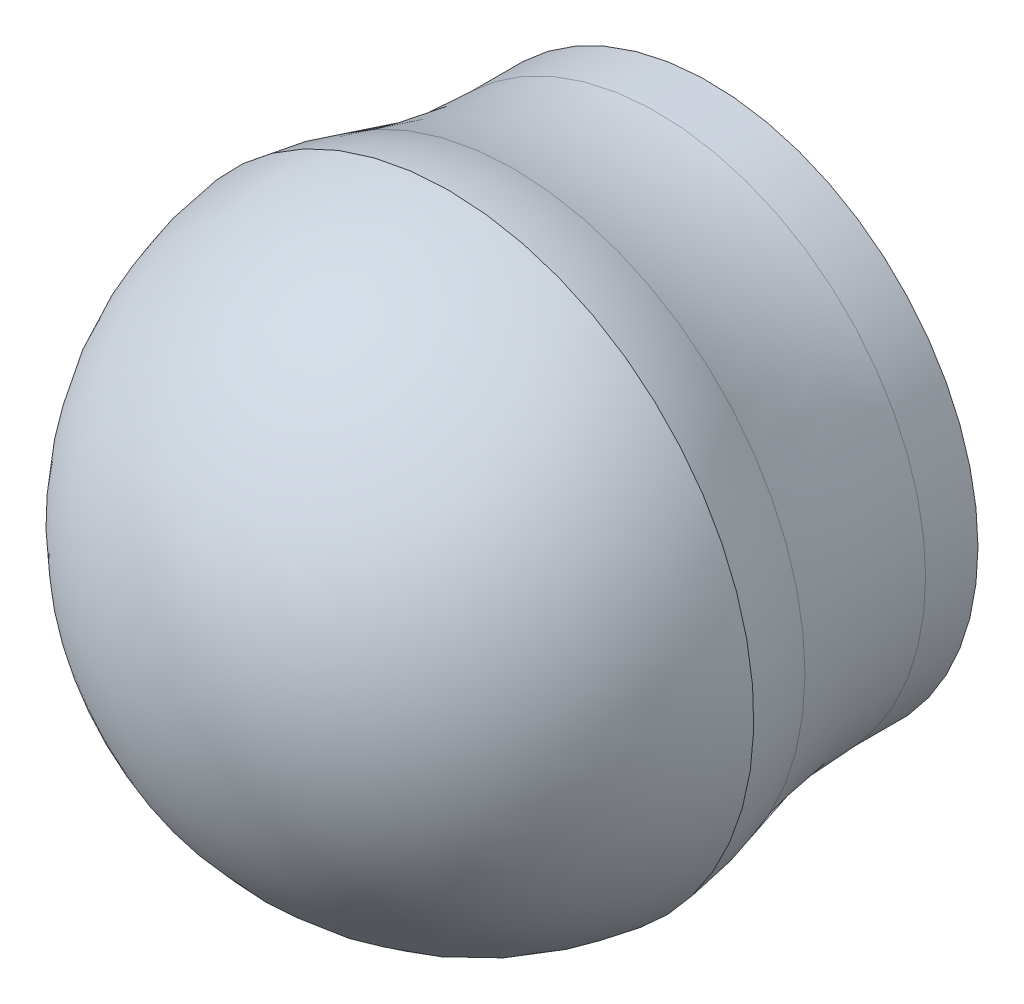
ISO-10303-21;
HEADER;
FILE_DESCRIPTION(('STEP AP214'),'2;1');
FILE_NAME('part.step','',(''),(''),'','','');
FILE_SCHEMA(('AUTOMOTIVE_DESIGN { 1 0 10303 214 1 1 1 1 }'));
ENDSEC;
DATA;
#1=APPLICATION_CONTEXT('core data for automotive mechanical design processes');
#2=APPLICATION_PROTOCOL_DEFINITION('international standard','automotive_design',2000,#1);
#3=PRODUCT_CONTEXT('',#1,'mechanical');
#4=PRODUCT('Part','Part','',(#3));
#5=PRODUCT_RELATED_PRODUCT_CATEGORY('part','',(#4));
#6=PRODUCT_DEFINITION_FORMATION('','',#4);
#7=PRODUCT_DEFINITION_CONTEXT('part definition',#1,'design');
#8=PRODUCT_DEFINITION('design','',#6,#7);
#9=PRODUCT_DEFINITION_SHAPE('','',#8);
#10=(LENGTH_UNIT() NAMED_UNIT(*) SI_UNIT(.MILLI.,.METRE.));
#11=(NAMED_UNIT(*) PLANE_ANGLE_UNIT() SI_UNIT($,.RADIAN.));
#12=(NAMED_UNIT(*) SI_UNIT($,.STERADIAN.) SOLID_ANGLE_UNIT());
#13=UNCERTAINTY_MEASURE_WITH_UNIT(LENGTH_MEASURE(1.E-05),#10,'distance_accuracy_value','');
#14=(GEOMETRIC_REPRESENTATION_CONTEXT(3) GLOBAL_UNCERTAINTY_ASSIGNED_CONTEXT((#13)) GLOBAL_UNIT_ASSIGNED_CONTEXT((#10,
#11,#12)) REPRESENTATION_CONTEXT('',''));
#15=CARTESIAN_POINT('',(0.,0.,0.));
#16=DIRECTION('',(0.,0.,1.));
#17=DIRECTION('',(1.,0.,0.));
#18=AXIS2_PLACEMENT_3D('',#15,#16,#17);
#19=CARTESIAN_POINT('',(0.,0.,57.847436919523));
#20=DIRECTION('',(0.,0.,1.));
#21=DIRECTION('',(0.,1.,0.));
#22=AXIS2_PLACEMENT_3D('',#19,#20,#21);
#23=SPHERICAL_SURFACE('',#22,18.);
#24=CARTESIAN_POINT('',(0.,0.,59.859750990432));
#25=DIRECTION('',(0.,0.,1.));
#26=DIRECTION('',(1.,0.,0.));
#27=AXIS2_PLACEMENT_3D('',#24,#25,#26);
#28=CIRCLE('',#27,17.8871627733417);
#29=CARTESIAN_POINT('',(17.8714322895514,0.75,59.859750990432));
#30=VERTEX_POINT('',#29);
#31=CARTESIAN_POINT('',(0.749999999999905,17.8714322895514,59.859750990432));
#32=VERTEX_POINT('',#31);
#33=EDGE_CURVE('E162',#30,#32,#28,.T.);
#34=ORIENTED_EDGE('',*,*,#33,.F.);
#35=CARTESIAN_POINT('',(0.,0.75,57.847436919523));
#36=DIRECTION('',(0.,1.,0.));
#37=DIRECTION('',(0.,0.,1.));
#38=AXIS2_PLACEMENT_3D('',#35,#36,#37);
#39=CIRCLE('',#38,17.9843682124227);
#40=CARTESIAN_POINT('',(7.46240577829965,0.750000000000001,74.2105050914765));
#41=VERTEX_POINT('',#40);
#42=EDGE_CURVE('E146',#41,#30,#39,.T.);
#43=ORIENTED_EDGE('',*,*,#42,.F.);
#44=CARTESIAN_POINT('',(0.,0.,74.2105050914765));
#45=DIRECTION('',(0.,0.,-1.));
#46=DIRECTION('',(-1.,0.,0.));
#47=AXIS2_PLACEMENT_3D('',#44,#45,#46);
#48=CIRCLE('',#47,7.5);
#49=CARTESIAN_POINT('',(0.749999999999943,7.46240577829965,74.2105050914765));
#50=VERTEX_POINT('',#49);
#51=EDGE_CURVE('E153',#50,#41,#48,.T.);
#52=ORIENTED_EDGE('',*,*,#51,.F.);
#53=CARTESIAN_POINT('',(0.749999999999971,0.,57.847436919523));
#54=DIRECTION('',(1.,0.,0.));
#55=DIRECTION('',(0.,1.,0.));
#56=AXIS2_PLACEMENT_3D('',#53,#54,#55);
#57=CIRCLE('',#56,17.9843682124227);
#58=EDGE_CURVE('E170',#32,#50,#57,.T.);
#59=ORIENTED_EDGE('',*,*,#58,.F.);
#60=EDGE_LOOP('',(#34,#43,#52,#59));
#61=FACE_BOUND('',#60,.T.);
#62=ADVANCED_FACE('F33',(#61),#23,.F.);
#63=CARTESIAN_POINT('',(-0.749999999999954,17.8714322895514,59.859750990432));
#64=VERTEX_POINT('',#63);
#65=CARTESIAN_POINT('',(-17.8714322895514,0.750000000000006,59.859750990432));
#66=VERTEX_POINT('',#65);
#67=EDGE_CURVE('E172',#64,#66,#28,.T.);
#68=ORIENTED_EDGE('',*,*,#67,.F.);
#69=CARTESIAN_POINT('',(-0.749999999999987,0.,57.847436919523));
#70=DIRECTION('',(-1.,0.,0.));
#71=DIRECTION('',(0.,-1.,0.));
#72=AXIS2_PLACEMENT_3D('',#69,#70,#71);
#73=CIRCLE('',#72,17.9843682124227);
#74=CARTESIAN_POINT('',(-0.749999999999974,7.46240577829965,74.2105050914765));
#75=VERTEX_POINT('',#74);
#76=EDGE_CURVE('E237',#75,#64,#73,.T.);
#77=ORIENTED_EDGE('',*,*,#76,.F.);
#78=CARTESIAN_POINT('',(0.,0.,74.2105050914765));
#79=DIRECTION('',(0.,0.,-1.));
#80=DIRECTION('',(-1.,0.,0.));
#81=AXIS2_PLACEMENT_3D('',#78,#79,#80);
#82=CIRCLE('',#81,7.5);
#83=CARTESIAN_POINT('',(-7.46240577829965,0.75,74.2105050914765));
#84=VERTEX_POINT('',#83);
#85=EDGE_CURVE('E234',#84,#75,#82,.T.);
#86=ORIENTED_EDGE('',*,*,#85,.F.);
#87=CARTESIAN_POINT('',(0.,0.75,57.847436919523));
#88=DIRECTION('',(0.,1.,0.));
#89=DIRECTION('',(0.,0.,1.));
#90=AXIS2_PLACEMENT_3D('',#87,#88,#89);
#91=CIRCLE('',#90,17.9843682124227);
#92=EDGE_CURVE('E230',#66,#84,#91,.T.);
#93=ORIENTED_EDGE('',*,*,#92,.F.);
#94=EDGE_LOOP('',(#68,#77,#86,#93));
#95=FACE_BOUND('',#94,.T.);
#96=ADVANCED_FACE('F328',(#95),#23,.F.);
#97=CARTESIAN_POINT('',(-17.8714322895514,-0.75,59.859750990432));
#98=VERTEX_POINT('',#97);
#99=CARTESIAN_POINT('',(-0.749999999999986,-17.8714322895514,59.859750990432));
#100=VERTEX_POINT('',#99);
#101=EDGE_CURVE('E180',#98,#100,#28,.T.);
#102=ORIENTED_EDGE('',*,*,#101,.F.);
#103=CARTESIAN_POINT('',(0.,-0.75,57.847436919523));
#104=DIRECTION('',(0.,-1.,0.));
#105=DIRECTION('',(0.,0.,-1.));
#106=AXIS2_PLACEMENT_3D('',#103,#104,#105);
#107=CIRCLE('',#106,17.9843682124227);
#108=CARTESIAN_POINT('',(-7.46240577829965,-0.750000000000001,74.2105050914765));
#109=VERTEX_POINT('',#108);
#110=EDGE_CURVE('E227',#109,#98,#107,.T.);
#111=ORIENTED_EDGE('',*,*,#110,.F.);
#112=CARTESIAN_POINT('',(0.,0.,74.2105050914765));
#113=DIRECTION('',(0.,0.,-1.));
#114=DIRECTION('',(-1.,0.,0.));
#115=AXIS2_PLACEMENT_3D('',#112,#113,#114);
#116=CIRCLE('',#115,7.5);
#117=CARTESIAN_POINT('',(-0.75,-7.46240577829965,74.2105050914765));
#118=VERTEX_POINT('',#117);
#119=EDGE_CURVE('E224',#118,#109,#116,.T.);
#120=ORIENTED_EDGE('',*,*,#119,.F.);
#121=CARTESIAN_POINT('',(-0.75,0.,57.847436919523));
#122=DIRECTION('',(-1.,0.,0.));
#123=DIRECTION('',(0.,-1.,0.));
#124=AXIS2_PLACEMENT_3D('',#121,#122,#123);
#125=CIRCLE('',#124,17.9843682124227);
#126=EDGE_CURVE('E220',#100,#118,#125,.T.);
#127=ORIENTED_EDGE('',*,*,#126,.F.);
#128=EDGE_LOOP('',(#102,#111,#120,#127));
#129=FACE_BOUND('',#128,.T.);
#130=ADVANCED_FACE('F311',(#129),#23,.F.);
#131=CARTESIAN_POINT('',(0.,0.,57.847436919523));
#132=DIRECTION('',(0.,0.,1.));
#133=DIRECTION('',(0.,1.,0.));
#134=AXIS2_PLACEMENT_3D('',#131,#132,#133);
#135=SPHERICAL_SURFACE('',#134,20.);
#136=CARTESIAN_POINT('',(0.,0.,59.859750990432));
#137=DIRECTION('',(0.,0.,1.));
#138=DIRECTION('',(1.,0.,0.));
#139=AXIS2_PLACEMENT_3D('',#136,#137,#138);
#140=CIRCLE('',#139,19.898507282709);
#141=CARTESIAN_POINT('',(0.,19.898507282709,59.859750990432));
#142=VERTEX_POINT('',#141);
#143=EDGE_CURVE('E205',#142,#142,#140,.T.);
#144=ORIENTED_EDGE('',*,*,#143,.T.);
#145=EDGE_LOOP('',(#144));
#146=FACE_BOUND('',#145,.T.);
#147=ADVANCED_FACE('F35',(#146),#135,.T.);
#148=CARTESIAN_POINT('',(0.75,-17.8714322895514,59.859750990432));
#149=VERTEX_POINT('',#148);
#150=CARTESIAN_POINT('',(17.8714322895514,-0.75,59.859750990432));
#151=VERTEX_POINT('',#150);
#152=EDGE_CURVE('E174',#149,#151,#28,.T.);
#153=ORIENTED_EDGE('',*,*,#152,.F.);
#154=CARTESIAN_POINT('',(0.749999999999999,0.,57.847436919523));
#155=DIRECTION('',(1.,0.,0.));
#156=DIRECTION('',(0.,1.,0.));
#157=AXIS2_PLACEMENT_3D('',#154,#155,#156);
#158=CIRCLE('',#157,17.9843682124227);
#159=CARTESIAN_POINT('',(0.750000000000001,-7.46240577829965,74.2105050914765));
#160=VERTEX_POINT('',#159);
#161=EDGE_CURVE('E217',#160,#149,#158,.T.);
#162=ORIENTED_EDGE('',*,*,#161,.F.);
#163=CARTESIAN_POINT('',(0.,0.,74.2105050914765));
#164=DIRECTION('',(0.,0.,-1.));
#165=DIRECTION('',(-1.,0.,0.));
#166=AXIS2_PLACEMENT_3D('',#163,#164,#165);
#167=CIRCLE('',#166,7.5);
#168=CARTESIAN_POINT('',(7.46240577829965,-0.75,74.2105050914765));
#169=VERTEX_POINT('',#168);
#170=EDGE_CURVE('E214',#169,#160,#167,.T.);
#171=ORIENTED_EDGE('',*,*,#170,.F.);
#172=CARTESIAN_POINT('',(0.,-0.75,57.847436919523));
#173=DIRECTION('',(0.,-1.,0.));
#174=DIRECTION('',(0.,0.,-1.));
#175=AXIS2_PLACEMENT_3D('',#172,#173,#174);
#176=CIRCLE('',#175,17.9843682124227);
#177=EDGE_CURVE('E209',#151,#169,#176,.T.);
#178=ORIENTED_EDGE('',*,*,#177,.F.);
#179=EDGE_LOOP('',(#153,#162,#171,#178));
#180=FACE_BOUND('',#179,.T.);
#181=ADVANCED_FACE('F346',(#180),#23,.F.);
#182=CARTESIAN_POINT('',(0.,0.,61.872065061341));
#183=DIRECTION('',(0.,0.,1.));
#184=DIRECTION('',(0.,1.,0.));
#185=AXIS2_PLACEMENT_3D('',#182,#183,#184);
#186=SPHERICAL_SURFACE('',#185,18.);
#187=ORIENTED_EDGE('',*,*,#101,.T.);
#188=CARTESIAN_POINT('',(-0.75,0.,61.872065061341));
#189=DIRECTION('',(-1.,0.,0.));
#190=DIRECTION('',(0.,-1.,0.));
#191=AXIS2_PLACEMENT_3D('',#188,#189,#190);
#192=CIRCLE('',#191,17.9843682124227);
#193=CARTESIAN_POINT('',(-0.75,-17.8160686091347,59.417436919523));
#194=VERTEX_POINT('',#193);
#195=EDGE_CURVE('E41',#100,#194,#192,.F.);
#196=ORIENTED_EDGE('',*,*,#195,.T.);
#197=CARTESIAN_POINT('',(0.,0.,59.417436919523));
#198=DIRECTION('',(0.,0.,-1.));
#199=DIRECTION('',(-1.,0.,0.));
#200=AXIS2_PLACEMENT_3D('',#197,#198,#199);
#201=CIRCLE('',#200,17.8318479324324);
#202=CARTESIAN_POINT('',(0.75,-17.8160686091347,59.417436919523));
#203=VERTEX_POINT('',#202);
#204=EDGE_CURVE('E165',#194,#203,#201,.F.);
#205=ORIENTED_EDGE('',*,*,#204,.T.);
#206=CARTESIAN_POINT('',(0.749999999999999,0.,61.872065061341));
#207=DIRECTION('',(1.,0.,0.));
#208=DIRECTION('',(0.,1.,0.));
#209=AXIS2_PLACEMENT_3D('',#206,#207,#208);
#210=CIRCLE('',#209,17.9843682124227);
#211=EDGE_CURVE('E300',#203,#149,#210,.F.);
#212=ORIENTED_EDGE('',*,*,#211,.T.);
#213=ORIENTED_EDGE('',*,*,#152,.T.);
#214=CARTESIAN_POINT('',(0.,-0.75,61.872065061341));
#215=DIRECTION('',(0.,-1.,0.));
#216=DIRECTION('',(0.,0.,-1.));
#217=AXIS2_PLACEMENT_3D('',#214,#215,#216);
#218=CIRCLE('',#217,17.9843682124227);
#219=CARTESIAN_POINT('',(17.8160686091347,-0.75,59.417436919523));
#220=VERTEX_POINT('',#219);
#221=EDGE_CURVE('E166',#151,#220,#218,.F.);
#222=ORIENTED_EDGE('',*,*,#221,.T.);
#223=CARTESIAN_POINT('',(17.8160686091347,0.75,59.417436919523));
#224=VERTEX_POINT('',#223);
#225=EDGE_CURVE('E164',#220,#224,#201,.F.);
#226=ORIENTED_EDGE('',*,*,#225,.T.);
#227=CARTESIAN_POINT('',(0.,0.75,61.872065061341));
#228=DIRECTION('',(0.,1.,0.));
#229=DIRECTION('',(0.,0.,1.));
#230=AXIS2_PLACEMENT_3D('',#227,#228,#229);
#231=CIRCLE('',#230,17.9843682124227);
#232=EDGE_CURVE('E56',#224,#30,#231,.F.);
#233=ORIENTED_EDGE('',*,*,#232,.T.);
#234=ORIENTED_EDGE('',*,*,#33,.T.);
#235=CARTESIAN_POINT('',(0.749999999999971,0.,61.872065061341));
#236=DIRECTION('',(1.,0.,0.));
#237=DIRECTION('',(0.,1.,0.));
#238=AXIS2_PLACEMENT_3D('',#235,#236,#237);
#239=CIRCLE('',#238,17.9843682124227);
#240=CARTESIAN_POINT('',(0.749999999999904,17.8160686091347,59.417436919523));
#241=VERTEX_POINT('',#240);
#242=EDGE_CURVE('E291',#32,#241,#239,.F.);
#243=ORIENTED_EDGE('',*,*,#242,.T.);
#244=CARTESIAN_POINT('',(-0.749999999999954,17.8160686091347,59.417436919523));
#245=VERTEX_POINT('',#244);
#246=EDGE_CURVE('E178',#241,#245,#201,.F.);
#247=ORIENTED_EDGE('',*,*,#246,.T.);
#248=CARTESIAN_POINT('',(-0.749999999999987,0.,61.872065061341));
#249=DIRECTION('',(-1.,0.,0.));
#250=DIRECTION('',(0.,-1.,0.));
#251=AXIS2_PLACEMENT_3D('',#248,#249,#250);
#252=CIRCLE('',#251,17.9843682124227);
#253=EDGE_CURVE('E293',#245,#64,#252,.F.);
#254=ORIENTED_EDGE('',*,*,#253,.T.);
#255=ORIENTED_EDGE('',*,*,#67,.T.);
#256=CARTESIAN_POINT('',(0.,0.75,61.872065061341));
#257=DIRECTION('',(0.,1.,0.));
#258=DIRECTION('',(0.,0.,1.));
#259=AXIS2_PLACEMENT_3D('',#256,#257,#258);
#260=CIRCLE('',#259,17.9843682124227);
#261=CARTESIAN_POINT('',(-17.8160686091347,0.75,59.417436919523));
#262=VERTEX_POINT('',#261);
#263=EDGE_CURVE('E318',#66,#262,#260,.F.);
#264=ORIENTED_EDGE('',*,*,#263,.T.);
#265=CARTESIAN_POINT('',(-17.8160686091347,-0.75,59.417436919523));
#266=VERTEX_POINT('',#265);
#267=EDGE_CURVE('E171',#262,#266,#201,.F.);
#268=ORIENTED_EDGE('',*,*,#267,.T.);
#269=CARTESIAN_POINT('',(0.,-0.75,61.872065061341));
#270=DIRECTION('',(0.,-1.,0.));
#271=DIRECTION('',(0.,0.,-1.));
#272=AXIS2_PLACEMENT_3D('',#269,#270,#271);
#273=CIRCLE('',#272,17.9843682124227);
#274=EDGE_CURVE('E176',#266,#98,#273,.F.);
#275=ORIENTED_EDGE('',*,*,#274,.T.);
#276=EDGE_LOOP('',(#187,#196,#205,#212,#213,#222,#226,#233,#234,#243,#247,#254,#255,#264,#268,#275));
#277=FACE_BOUND('',#276,.T.);
#278=CARTESIAN_POINT('',(0.,0.,56.2515668627824));
#279=DIRECTION('',(0.,0.,1.));
#280=DIRECTION('',(1.,0.,0.));
#281=AXIS2_PLACEMENT_3D('',#278,#279,#280);
#282=CIRCLE('',#281,17.1);
#283=CARTESIAN_POINT('',(17.1,0.,56.2515668627824));
#284=VERTEX_POINT('',#283);
#285=EDGE_CURVE('E183',#284,#284,#282,.T.);
#286=ORIENTED_EDGE('',*,*,#285,.F.);
#287=EDGE_LOOP('',(#286));
#288=FACE_BOUND('',#287,.T.);
#289=ADVANCED_FACE('F159',(#277,#288),#186,.F.);
#290=CARTESIAN_POINT('',(0.,0.,46.259570065345));
#291=DIRECTION('',(0.,0.,1.));
#292=DIRECTION('',(1.,0.,0.));
#293=AXIS2_PLACEMENT_3D('',#290,#291,#292);
#294=TOROIDAL_SURFACE('',#293,47.5,32.);
#295=CARTESIAN_POINT('',(0.,0.,46.2595700653449));
#296=DIRECTION('',(0.,0.,1.));
#297=DIRECTION('',(1.,0.,0.));
#298=AXIS2_PLACEMENT_3D('',#295,#296,#297);
#299=CIRCLE('',#298,15.5);
#300=CARTESIAN_POINT('',(15.5,0.,46.2595700653449));
#301=VERTEX_POINT('',#300);
#302=EDGE_CURVE('E187',#301,#301,#299,.T.);
#303=ORIENTED_EDGE('',*,*,#302,.F.);
#304=EDGE_LOOP('',(#303));
#305=FACE_BOUND('',#304,.T.);
#306=ORIENTED_EDGE('',*,*,#285,.T.);
#307=EDGE_LOOP('',(#306));
#308=FACE_BOUND('',#307,.T.);
#309=ADVANCED_FACE('F358',(#305,#308),#294,.T.);
#310=CARTESIAN_POINT('',(0.,0.,77.847436919523));
#311=DIRECTION('',(0.,0.,1.));
#312=DIRECTION('',(1.,0.,0.));
#313=AXIS2_PLACEMENT_3D('',#310,#311,#312);
#314=CYLINDRICAL_SURFACE('',#313,15.5);
#315=CARTESIAN_POINT('',(0.,0.,42.847436919523));
#316=DIRECTION('',(0.,0.,1.));
#317=DIRECTION('',(1.,0.,0.));
#318=AXIS2_PLACEMENT_3D('',#315,#316,#317);
#319=CIRCLE('',#318,15.5);
#320=CARTESIAN_POINT('',(15.5,0.,42.847436919523));
#321=VERTEX_POINT('',#320);
#322=EDGE_CURVE('E191',#321,#321,#319,.T.);
#323=ORIENTED_EDGE('',*,*,#322,.F.);
#324=EDGE_LOOP('',(#323));
#325=FACE_BOUND('',#324,.T.);
#326=ORIENTED_EDGE('',*,*,#302,.T.);
#327=EDGE_LOOP('',(#326));
#328=FACE_BOUND('',#327,.T.);
#329=ADVANCED_FACE('F389',(#325,#328),#314,.F.);
#330=CARTESIAN_POINT('',(0.,17.5,42.847436919523));
#331=DIRECTION('',(0.,0.,1.));
#332=DIRECTION('',(1.,0.,0.));
#333=AXIS2_PLACEMENT_3D('',#330,#331,#332);
#334=PLANE('',#333);
#335=CARTESIAN_POINT('',(0.,0.,42.847436919523));
#336=DIRECTION('',(0.,0.,1.));
#337=DIRECTION('',(1.,0.,0.));
#338=AXIS2_PLACEMENT_3D('',#335,#336,#337);
#339=CIRCLE('',#338,17.5);
#340=CARTESIAN_POINT('',(17.5,0.,42.847436919523));
#341=VERTEX_POINT('',#340);
#342=EDGE_CURVE('E196',#341,#341,#339,.T.);
#343=ORIENTED_EDGE('',*,*,#342,.F.);
#344=EDGE_LOOP('',(#343));
#345=FACE_BOUND('',#344,.T.);
#346=ORIENTED_EDGE('',*,*,#322,.T.);
#347=EDGE_LOOP('',(#346));
#348=FACE_BOUND('',#347,.T.);
#349=ADVANCED_FACE('F400',(#345,#348),#334,.F.);
#350=CARTESIAN_POINT('',(0.,0.,77.847436919523));
#351=DIRECTION('',(0.,0.,1.));
#352=DIRECTION('',(1.,0.,0.));
#353=AXIS2_PLACEMENT_3D('',#350,#351,#352);
#354=CYLINDRICAL_SURFACE('',#353,17.5);
#355=CARTESIAN_POINT('',(0.,0.,46.259570065345));
#356=DIRECTION('',(0.,0.,1.));
#357=DIRECTION('',(1.,0.,0.));
#358=AXIS2_PLACEMENT_3D('',#355,#356,#357);
#359=CIRCLE('',#358,17.5);
#360=CARTESIAN_POINT('',(17.5,0.,46.259570065345));
#361=VERTEX_POINT('',#360);
#362=EDGE_CURVE('E199',#361,#361,#359,.T.);
#363=ORIENTED_EDGE('',*,*,#362,.F.);
#364=EDGE_LOOP('',(#363));
#365=FACE_BOUND('',#364,.T.);
#366=ORIENTED_EDGE('',*,*,#342,.T.);
#367=EDGE_LOOP('',(#366));
#368=FACE_BOUND('',#367,.T.);
#369=ADVANCED_FACE('F410',(#365,#368),#354,.T.);
#370=CARTESIAN_POINT('',(0.,0.,46.259570065345));
#371=DIRECTION('',(0.,0.,1.));
#372=DIRECTION('',(1.,0.,0.));
#373=AXIS2_PLACEMENT_3D('',#370,#371,#372);
#374=TOROIDAL_SURFACE('',#373,47.5,30.);
#375=CARTESIAN_POINT('',(0.,0.,55.6270670629426));
#376=DIRECTION('',(0.,0.,1.));
#377=DIRECTION('',(1.,0.,0.));
#378=AXIS2_PLACEMENT_3D('',#375,#376,#377);
#379=CIRCLE('',#378,19.);
#380=CARTESIAN_POINT('',(0.,19.,55.6270670629426));
#381=VERTEX_POINT('',#380);
#382=EDGE_CURVE('E202',#381,#381,#379,.T.);
#383=ORIENTED_EDGE('',*,*,#382,.F.);
#384=EDGE_LOOP('',(#383));
#385=FACE_BOUND('',#384,.T.);
#386=ORIENTED_EDGE('',*,*,#362,.T.);
#387=EDGE_LOOP('',(#386));
#388=FACE_BOUND('',#387,.T.);
#389=ADVANCED_FACE('F420',(#385,#388),#374,.F.);
#390=CARTESIAN_POINT('',(0.,0.,61.872065061341));
#391=DIRECTION('',(0.,0.,1.));
#392=DIRECTION('',(0.,1.,0.));
#393=AXIS2_PLACEMENT_3D('',#390,#391,#392);
#394=SPHERICAL_SURFACE('',#393,20.);
#395=CARTESIAN_POINT('',(0.,19.898507282709,59.859750990432));
#396=CARTESIAN_POINT('',(0.,19.8939633504271,59.8148188790255));
#397=CARTESIAN_POINT('',(0.,19.8892672238206,59.7699021588928));
#398=CARTESIAN_POINT('',(0.,19.8795708084696,59.6801015611928));
#399=CARTESIAN_POINT('',(0.,19.874570519725,59.6352176836256));
#400=CARTESIAN_POINT('',(0.,19.8642660066091,59.5454848310746));
#401=CARTESIAN_POINT('',(0.,19.8589617822378,59.5006358560909));
#402=CARTESIAN_POINT('',(0.,19.8480496420669,59.4109748667195));
#403=CARTESIAN_POINT('',(0.,19.8424417262674,59.3661628523318));
#404=CARTESIAN_POINT('',(0.,19.830922460373,59.2765778405772));
#405=CARTESIAN_POINT('',(0.,19.8250111102781,59.2318048432102));
#406=CARTESIAN_POINT('',(0.,19.8128852471186,59.142299920102));
#407=CARTESIAN_POINT('',(0.,19.8066707340541,59.0975679943608));
#408=CARTESIAN_POINT('',(0.,19.7939388301212,59.0081472672325));
#409=CARTESIAN_POINT('',(0.,19.7874214392529,58.9634584658453));
#410=CARTESIAN_POINT('',(0.,19.7740840787963,58.8741260381721));
#411=CARTESIAN_POINT('',(0.,19.7672641092081,58.8294824118861));
#412=CARTESIAN_POINT('',(0.,19.753321904276,58.7402423830898));
#413=CARTESIAN_POINT('',(0.,19.746199668932,58.6956459805796));
#414=CARTESIAN_POINT('',(0.,19.7316532593245,58.6065024458423));
#415=CARTESIAN_POINT('',(0.,19.724229085061,58.5619553136152));
#416=CARTESIAN_POINT('',(0.,19.7090791383061,58.4729123636907));
#417=CARTESIAN_POINT('',(0.,19.7013533658147,58.4284165459933));
#418=CARTESIAN_POINT('',(0.,19.6856005771361,58.3394782670198));
#419=CARTESIAN_POINT('',(0.,19.6775735609489,58.2950358057436));
#420=CARTESIAN_POINT('',(0.,19.6612186532345,58.2062062790558));
#421=CARTESIAN_POINT('',(0.,19.6528907617074,58.1618192136441));
#422=CARTESIAN_POINT('',(0.,19.635934485476,58.0731025155862));
#423=CARTESIAN_POINT('',(0.,19.6273061007719,58.02877288294));
#424=CARTESIAN_POINT('',(0.,19.6097492341389,57.9401730846786));
#425=CARTESIAN_POINT('',(0.,19.6008207522102,57.8959029190634));
#426=CARTESIAN_POINT('',(0.,19.5826641008518,57.8074240864006));
#427=CARTESIAN_POINT('',(0.,19.5734359314222,57.7632154193529));
#428=CARTESIAN_POINT('',(0.,19.5546803285384,57.6748616125397));
#429=CARTESIAN_POINT('',(0.,19.5451528950841,57.6307164727741));
#430=CARTESIAN_POINT('',(0.,19.5257992013604,57.5424917463241));
#431=CARTESIAN_POINT('',(0.,19.515972941091,57.4984121596397));
#432=CARTESIAN_POINT('',(0.,19.4960220446591,57.4103205621431));
#433=CARTESIAN_POINT('',(0.,19.4858974084967,57.366308551331));
#434=CARTESIAN_POINT('',(0.,19.4653502248936,57.2783541252689));
#435=CARTESIAN_POINT('',(0.,19.454927677453,57.2344117100189));
#436=CARTESIAN_POINT('',(0.,19.4337851495792,57.1465984915776));
#437=CARTESIAN_POINT('',(0.,19.423065169146,57.1027276883861));
#438=CARTESIAN_POINT('',(0.,19.4013282672217,57.0150597072718));
#439=CARTESIAN_POINT('',(0.,19.3903113457307,56.9712625293488));
#440=CARTESIAN_POINT('',(0.,19.3679810672521,56.883743808603));
#441=CARTESIAN_POINT('',(0.,19.3566677102645,56.84002226578));
#442=CARTESIAN_POINT('',(0.,19.3337450799573,56.7526568215945));
#443=CARTESIAN_POINT('',(0.,19.3221358066376,56.709012920232));
#444=CARTESIAN_POINT('',(0.,19.29862187641,56.6218047617652));
#445=CARTESIAN_POINT('',(0.,19.286717219502,56.5782405046608));
#446=CARTESIAN_POINT('',(0.,19.2626130683977,56.4911936338528));
#447=CARTESIAN_POINT('',(0.,19.2504135742014,56.4477110201491));
#448=CARTESIAN_POINT('',(0.,19.2257203083454,56.3608294315397));
#449=CARTESIAN_POINT('',(0.,19.2132265366858,56.3174304566341));
#450=CARTESIAN_POINT('',(0.,19.187945289251,56.2307181371742));
#451=CARTESIAN_POINT('',(0.,19.1751578134758,56.1874047926201));
#452=CARTESIAN_POINT('',(0.,19.1492897445665,56.1008657215092));
#453=CARTESIAN_POINT('',(0.,19.1362091514325,56.0576399949524));
#454=CARTESIAN_POINT('',(0.,19.1097554482705,55.971278143379));
#455=CARTESIAN_POINT('',(0.,19.0963823382425,55.9281420183624));
#456=CARTESIAN_POINT('',(0.,19.0693442142215,55.8419613496082));
#457=CARTESIAN_POINT('',(0.,19.0556792002284,55.7989168058708));
#458=CARTESIAN_POINT('',(0.,19.0280578981825,55.7129212740612));
#459=CARTESIAN_POINT('',(0.,19.0141016101298,55.669970285989));
#460=CARTESIAN_POINT('',(0.,19.,55.6270670629426));
#461=B_SPLINE_CURVE_WITH_KNOTS('',3,(#395,#396,#397,#398,#399,#400,#401,#402,#403,#404,#405,
#406,#407,#408,#409,#410,#411,#412,#413,#414,#415,#416,#417,#418,#419,#420,#421,#422,#423,#424,
#425,#426,#427,#428,#429,#430,#431,#432,#433,#434,#435,#436,#437,#438,#439,#440,#441,#442,#443,
#444,#445,#446,#447,#448,#449,#450,#451,#452,#453,#454,#455,#456,#457,#458,#459,#460),
.UNSPECIFIED.,.F.,.F.,(4,2,2,2,2,2,2,2,2,2,2,2,2,2,2,2,2,2,2,2,2,2,2,2,2,2,2,2,2,2,2,2,4),(0.,
0.135483605633334,0.270967211266674,0.406450816900014,0.541934422533356,0.677418028166691,
0.812901633800035,0.948385239433372,1.08386884506671,1.21935245070005,1.35483605633339,
1.49031966196673,1.62580326760007,1.76128687323341,1.89677047886675,2.03225408450008,
2.16773769013343,2.30322129576677,2.43870490140011,2.57418850703345,2.70967211266679,
2.84515571830012,2.98063932393347,3.1161229295668,3.25160653520014,3.38709014083348,
3.52257374646682,3.65805735210016,3.7935409577335,3.92902456336684,4.06450816900017,
4.19999177463351,4.33547538026685),.UNSPECIFIED.);
#462=EDGE_CURVE('BSEAM430',#142,#381,#461,.T.);
#463=ORIENTED_EDGE('',*,*,#143,.F.);
#464=ORIENTED_EDGE('',*,*,#382,.T.);
#465=ORIENTED_EDGE('',*,*,#462,.T.);
#466=ORIENTED_EDGE('',*,*,#462,.F.);
#467=EDGE_LOOP('',(#463,#465,#464,#466));
#468=FACE_BOUND('',#467,.T.);
#469=ADVANCED_FACE('F430',(#468),#394,.T.);
#470=CARTESIAN_POINT('',(17.8714322895514,0.75,123.995552363112));
#471=DIRECTION('',(0.,1.,0.));
#472=DIRECTION('',(0.,0.,1.));
#473=AXIS2_PLACEMENT_3D('',#470,#471,#472);
#474=PLANE('',#473);
#475=ORIENTED_EDGE('',*,*,#232,.F.);
#476=DIRECTION('',(1.,0.,0.));
#477=VECTOR('',#476,1.);
#478=CARTESIAN_POINT('',(17.8714322895514,0.75,59.417436919523));
#479=LINE('',#478,#477);
#480=CARTESIAN_POINT('',(7.46240577829965,0.750000000000001,59.417436919523));
#481=VERTEX_POINT('',#480);
#482=EDGE_CURVE('E208',#481,#224,#479,.T.);
#483=ORIENTED_EDGE('',*,*,#482,.F.);
#484=DIRECTION('',(0.,0.,-1.));
#485=VECTOR('',#484,1.);
#486=CARTESIAN_POINT('',(7.46240577829965,0.750000000000001,123.995552363112));
#487=LINE('',#486,#485);
#488=EDGE_CURVE('E148',#41,#481,#487,.T.);
#489=ORIENTED_EDGE('',*,*,#488,.F.);
#490=ORIENTED_EDGE('',*,*,#42,.T.);
#491=EDGE_LOOP('',(#475,#483,#489,#490));
#492=FACE_BOUND('',#491,.T.);
#493=ADVANCED_FACE('F147',(#492),#474,.T.);
#494=CARTESIAN_POINT('',(0.749999999999943,7.46240577829965,123.995552363112));
#495=DIRECTION('',(1.,0.,0.));
#496=DIRECTION('',(0.,1.,0.));
#497=AXIS2_PLACEMENT_3D('',#494,#495,#496);
#498=PLANE('',#497);
#499=ORIENTED_EDGE('',*,*,#242,.F.);
#500=ORIENTED_EDGE('',*,*,#58,.T.);
#501=DIRECTION('',(0.,0.,-1.));
#502=VECTOR('',#501,1.);
#503=CARTESIAN_POINT('',(0.749999999999943,7.46240577829965,123.995552363112));
#504=LINE('',#503,#502);
#505=CARTESIAN_POINT('',(0.749999999999943,7.46240577829965,59.417436919523));
#506=VERTEX_POINT('',#505);
#507=EDGE_CURVE('E239',#50,#506,#504,.T.);
#508=ORIENTED_EDGE('',*,*,#507,.T.);
#509=DIRECTION('',(0.,-1.,0.));
#510=VECTOR('',#509,1.);
#511=CARTESIAN_POINT('',(0.749999999999943,7.46240577829965,59.417436919523));
#512=LINE('',#511,#510);
#513=EDGE_CURVE('E278',#241,#506,#512,.T.);
#514=ORIENTED_EDGE('',*,*,#513,.F.);
#515=EDGE_LOOP('',(#499,#500,#508,#514));
#516=FACE_BOUND('',#515,.T.);
#517=ADVANCED_FACE('F290',(#516),#498,.T.);
#518=CARTESIAN_POINT('',(-0.749999999999973,7.46240577829965,123.995552363112));
#519=DIRECTION('',(-1.,0.,0.));
#520=DIRECTION('',(0.,-1.,0.));
#521=AXIS2_PLACEMENT_3D('',#518,#519,#520);
#522=PLANE('',#521);
#523=ORIENTED_EDGE('',*,*,#253,.F.);
#524=DIRECTION('',(0.,1.,0.));
#525=VECTOR('',#524,1.);
#526=CARTESIAN_POINT('',(-0.749999999999973,7.46240577829965,59.417436919523));
#527=LINE('',#526,#525);
#528=CARTESIAN_POINT('',(-0.749999999999974,7.46240577829965,59.417436919523));
#529=VERTEX_POINT('',#528);
#530=EDGE_CURVE('E275',#529,#245,#527,.T.);
#531=ORIENTED_EDGE('',*,*,#530,.F.);
#532=DIRECTION('',(0.,0.,-1.));
#533=VECTOR('',#532,1.);
#534=CARTESIAN_POINT('',(-0.749999999999974,7.46240577829965,123.995552363112));
#535=LINE('',#534,#533);
#536=EDGE_CURVE('E233',#75,#529,#535,.T.);
#537=ORIENTED_EDGE('',*,*,#536,.F.);
#538=ORIENTED_EDGE('',*,*,#76,.T.);
#539=EDGE_LOOP('',(#523,#531,#537,#538));
#540=FACE_BOUND('',#539,.T.);
#541=ADVANCED_FACE('F324',(#540),#522,.T.);
#542=CARTESIAN_POINT('',(-7.46240577829965,0.75,123.995552363112));
#543=DIRECTION('',(0.,1.,0.));
#544=DIRECTION('',(0.,0.,1.));
#545=AXIS2_PLACEMENT_3D('',#542,#543,#544);
#546=PLANE('',#545);
#547=ORIENTED_EDGE('',*,*,#263,.F.);
#548=ORIENTED_EDGE('',*,*,#92,.T.);
#549=DIRECTION('',(0.,0.,-1.));
#550=VECTOR('',#549,1.);
#551=CARTESIAN_POINT('',(-7.46240577829965,0.75,123.995552363112));
#552=LINE('',#551,#550);
#553=CARTESIAN_POINT('',(-7.46240577829965,0.75,59.417436919523));
#554=VERTEX_POINT('',#553);
#555=EDGE_CURVE('E229',#84,#554,#552,.T.);
#556=ORIENTED_EDGE('',*,*,#555,.T.);
#557=DIRECTION('',(1.,0.,0.));
#558=VECTOR('',#557,1.);
#559=CARTESIAN_POINT('',(-7.46240577829965,0.75,59.417436919523));
#560=LINE('',#559,#558);
#561=EDGE_CURVE('E270',#262,#554,#560,.T.);
#562=ORIENTED_EDGE('',*,*,#561,.F.);
#563=EDGE_LOOP('',(#547,#548,#556,#562));
#564=FACE_BOUND('',#563,.T.);
#565=ADVANCED_FACE('F331',(#564),#546,.T.);
#566=CARTESIAN_POINT('',(-7.46240577829965,-0.75,123.995552363112));
#567=DIRECTION('',(0.,-1.,0.));
#568=DIRECTION('',(0.,0.,-1.));
#569=AXIS2_PLACEMENT_3D('',#566,#567,#568);
#570=PLANE('',#569);
#571=ORIENTED_EDGE('',*,*,#274,.F.);
#572=DIRECTION('',(-1.,0.,0.));
#573=VECTOR('',#572,1.);
#574=CARTESIAN_POINT('',(-7.46240577829965,-0.75,59.417436919523));
#575=LINE('',#574,#573);
#576=CARTESIAN_POINT('',(-7.46240577829965,-0.750000000000001,59.417436919523));
#577=VERTEX_POINT('',#576);
#578=EDGE_CURVE('E48',#577,#266,#575,.T.);
#579=ORIENTED_EDGE('',*,*,#578,.F.);
#580=DIRECTION('',(0.,0.,-1.));
#581=VECTOR('',#580,1.);
#582=CARTESIAN_POINT('',(-7.46240577829965,-0.750000000000001,123.995552363112));
#583=LINE('',#582,#581);
#584=EDGE_CURVE('E223',#109,#577,#583,.T.);
#585=ORIENTED_EDGE('',*,*,#584,.F.);
#586=ORIENTED_EDGE('',*,*,#110,.T.);
#587=EDGE_LOOP('',(#571,#579,#585,#586));
#588=FACE_BOUND('',#587,.T.);
#589=ADVANCED_FACE('F334',(#588),#570,.T.);
#590=CARTESIAN_POINT('',(-0.75,-17.8714322895514,123.995552363112));
#591=DIRECTION('',(-1.,0.,0.));
#592=DIRECTION('',(0.,-1.,0.));
#593=AXIS2_PLACEMENT_3D('',#590,#591,#592);
#594=PLANE('',#593);
#595=ORIENTED_EDGE('',*,*,#195,.F.);
#596=ORIENTED_EDGE('',*,*,#126,.T.);
#597=DIRECTION('',(0.,0.,-1.));
#598=VECTOR('',#597,1.);
#599=CARTESIAN_POINT('',(-0.75,-7.46240577829965,123.995552363112));
#600=LINE('',#599,#598);
#601=CARTESIAN_POINT('',(-0.75,-7.46240577829965,59.417436919523));
#602=VERTEX_POINT('',#601);
#603=EDGE_CURVE('E219',#118,#602,#600,.T.);
#604=ORIENTED_EDGE('',*,*,#603,.T.);
#605=DIRECTION('',(0.,1.,0.));
#606=VECTOR('',#605,1.);
#607=CARTESIAN_POINT('',(-0.75,-17.8714322895514,59.417436919523));
#608=LINE('',#607,#606);
#609=EDGE_CURVE('E265',#194,#602,#608,.T.);
#610=ORIENTED_EDGE('',*,*,#609,.F.);
#611=EDGE_LOOP('',(#595,#596,#604,#610));
#612=FACE_BOUND('',#611,.T.);
#613=ADVANCED_FACE('F308',(#612),#594,.T.);
#614=CARTESIAN_POINT('',(0.75,-17.8714322895514,123.995552363112));
#615=DIRECTION('',(1.,0.,0.));
#616=DIRECTION('',(0.,1.,0.));
#617=AXIS2_PLACEMENT_3D('',#614,#615,#616);
#618=PLANE('',#617);
#619=ORIENTED_EDGE('',*,*,#211,.F.);
#620=DIRECTION('',(0.,-1.,0.));
#621=VECTOR('',#620,1.);
#622=CARTESIAN_POINT('',(0.75,-17.8714322895514,59.417436919523));
#623=LINE('',#622,#621);
#624=CARTESIAN_POINT('',(0.750000000000001,-7.46240577829965,59.417436919523));
#625=VERTEX_POINT('',#624);
#626=EDGE_CURVE('E262',#625,#203,#623,.T.);
#627=ORIENTED_EDGE('',*,*,#626,.F.);
#628=DIRECTION('',(0.,0.,-1.));
#629=VECTOR('',#628,1.);
#630=CARTESIAN_POINT('',(0.750000000000001,-7.46240577829965,123.995552363112));
#631=LINE('',#630,#629);
#632=EDGE_CURVE('E213',#160,#625,#631,.T.);
#633=ORIENTED_EDGE('',*,*,#632,.F.);
#634=ORIENTED_EDGE('',*,*,#161,.T.);
#635=EDGE_LOOP('',(#619,#627,#633,#634));
#636=FACE_BOUND('',#635,.T.);
#637=ADVANCED_FACE('F341',(#636),#618,.T.);
#638=CARTESIAN_POINT('',(17.8714322895514,-0.75,123.995552363112));
#639=DIRECTION('',(0.,-1.,0.));
#640=DIRECTION('',(0.,0.,-1.));
#641=AXIS2_PLACEMENT_3D('',#638,#639,#640);
#642=PLANE('',#641);
#643=ORIENTED_EDGE('',*,*,#221,.F.);
#644=ORIENTED_EDGE('',*,*,#177,.T.);
#645=DIRECTION('',(0.,0.,-1.));
#646=VECTOR('',#645,1.);
#647=CARTESIAN_POINT('',(7.46240577829965,-0.75,123.995552363112));
#648=LINE('',#647,#646);
#649=CARTESIAN_POINT('',(7.46240577829965,-0.75,59.417436919523));
#650=VERTEX_POINT('',#649);
#651=EDGE_CURVE('E212',#169,#650,#648,.T.);
#652=ORIENTED_EDGE('',*,*,#651,.T.);
#653=DIRECTION('',(-1.,0.,0.));
#654=VECTOR('',#653,1.);
#655=CARTESIAN_POINT('',(17.8714322895514,-0.75,59.417436919523));
#656=LINE('',#655,#654);
#657=EDGE_CURVE('E257',#220,#650,#656,.T.);
#658=ORIENTED_EDGE('',*,*,#657,.F.);
#659=EDGE_LOOP('',(#643,#644,#652,#658));
#660=FACE_BOUND('',#659,.T.);
#661=ADVANCED_FACE('F505',(#660),#642,.T.);
#662=CARTESIAN_POINT('',(0.,0.,59.417436919523));
#663=DIRECTION('',(0.,0.,-1.));
#664=DIRECTION('',(-1.,0.,0.));
#665=AXIS2_PLACEMENT_3D('',#662,#663,#664);
#666=PLANE('',#665);
#667=CARTESIAN_POINT('',(0.,0.,59.417436919523));
#668=DIRECTION('',(0.,0.,-1.));
#669=DIRECTION('',(-1.,0.,0.));
#670=AXIS2_PLACEMENT_3D('',#667,#668,#669);
#671=CIRCLE('',#670,5.);
#672=CARTESIAN_POINT('',(-5.,0.,59.417436919523));
#673=VERTEX_POINT('',#672);
#674=EDGE_CURVE('E244',#673,#673,#671,.T.);
#675=ORIENTED_EDGE('',*,*,#674,.F.);
#676=EDGE_LOOP('',(#675));
#677=FACE_BOUND('',#676,.T.);
#678=ORIENTED_EDGE('',*,*,#204,.F.);
#679=ORIENTED_EDGE('',*,*,#609,.T.);
#680=CARTESIAN_POINT('',(0.,0.,59.417436919523));
#681=DIRECTION('',(0.,0.,-1.));
#682=DIRECTION('',(-1.,0.,0.));
#683=AXIS2_PLACEMENT_3D('',#680,#681,#682);
#684=CIRCLE('',#683,7.5);
#685=EDGE_CURVE('E267',#602,#577,#684,.T.);
#686=ORIENTED_EDGE('',*,*,#685,.T.);
#687=ORIENTED_EDGE('',*,*,#578,.T.);
#688=ORIENTED_EDGE('',*,*,#267,.F.);
#689=ORIENTED_EDGE('',*,*,#561,.T.);
#690=CARTESIAN_POINT('',(0.,0.,59.417436919523));
#691=DIRECTION('',(0.,0.,-1.));
#692=DIRECTION('',(-1.,0.,0.));
#693=AXIS2_PLACEMENT_3D('',#690,#691,#692);
#694=CIRCLE('',#693,7.5);
#695=EDGE_CURVE('E272',#554,#529,#694,.T.);
#696=ORIENTED_EDGE('',*,*,#695,.T.);
#697=ORIENTED_EDGE('',*,*,#530,.T.);
#698=ORIENTED_EDGE('',*,*,#246,.F.);
#699=ORIENTED_EDGE('',*,*,#513,.T.);
#700=CARTESIAN_POINT('',(0.,0.,59.417436919523));
#701=DIRECTION('',(0.,0.,-1.));
#702=DIRECTION('',(-1.,0.,0.));
#703=AXIS2_PLACEMENT_3D('',#700,#701,#702);
#704=CIRCLE('',#703,7.5);
#705=EDGE_CURVE('E280',#506,#481,#704,.T.);
#706=ORIENTED_EDGE('',*,*,#705,.T.);
#707=ORIENTED_EDGE('',*,*,#482,.T.);
#708=ORIENTED_EDGE('',*,*,#225,.F.);
#709=ORIENTED_EDGE('',*,*,#657,.T.);
#710=CARTESIAN_POINT('',(0.,0.,59.417436919523));
#711=DIRECTION('',(0.,0.,-1.));
#712=DIRECTION('',(-1.,0.,0.));
#713=AXIS2_PLACEMENT_3D('',#710,#711,#712);
#714=CIRCLE('',#713,7.5);
#715=EDGE_CURVE('E259',#650,#625,#714,.T.);
#716=ORIENTED_EDGE('',*,*,#715,.T.);
#717=ORIENTED_EDGE('',*,*,#626,.T.);
#718=EDGE_LOOP('',(#678,#679,#686,#687,#688,#689,#696,#697,#698,#699,#706,#707,#708,#709,#716,#717));
#719=FACE_BOUND('',#718,.T.);
#720=ADVANCED_FACE('F283',(#677,#719),#666,.T.);
#721=CARTESIAN_POINT('',(0.,0.,123.995552363112));
#722=DIRECTION('',(0.,0.,-1.));
#723=DIRECTION('',(-1.,0.,0.));
#724=AXIS2_PLACEMENT_3D('',#721,#722,#723);
#725=CYLINDRICAL_SURFACE('',#724,7.5);
#726=ORIENTED_EDGE('',*,*,#507,.F.);
#727=ORIENTED_EDGE('',*,*,#51,.T.);
#728=ORIENTED_EDGE('',*,*,#488,.T.);
#729=ORIENTED_EDGE('',*,*,#705,.F.);
#730=EDGE_LOOP('',(#726,#727,#728,#729));
#731=FACE_BOUND('',#730,.T.);
#732=ADVANCED_FACE('F288',(#731),#725,.T.);
#733=CARTESIAN_POINT('',(0.,0.,123.995552363112));
#734=DIRECTION('',(0.,0.,-1.));
#735=DIRECTION('',(-1.,0.,0.));
#736=AXIS2_PLACEMENT_3D('',#733,#734,#735);
#737=CYLINDRICAL_SURFACE('',#736,7.5);
#738=ORIENTED_EDGE('',*,*,#555,.F.);
#739=ORIENTED_EDGE('',*,*,#85,.T.);
#740=ORIENTED_EDGE('',*,*,#536,.T.);
#741=ORIENTED_EDGE('',*,*,#695,.F.);
#742=EDGE_LOOP('',(#738,#739,#740,#741));
#743=FACE_BOUND('',#742,.T.);
#744=ADVANCED_FACE('F480',(#743),#737,.T.);
#745=CARTESIAN_POINT('',(0.,0.,123.995552363112));
#746=DIRECTION('',(0.,0.,-1.));
#747=DIRECTION('',(-1.,0.,0.));
#748=AXIS2_PLACEMENT_3D('',#745,#746,#747);
#749=CYLINDRICAL_SURFACE('',#748,7.5);
#750=ORIENTED_EDGE('',*,*,#603,.F.);
#751=ORIENTED_EDGE('',*,*,#119,.T.);
#752=ORIENTED_EDGE('',*,*,#584,.T.);
#753=ORIENTED_EDGE('',*,*,#685,.F.);
#754=EDGE_LOOP('',(#750,#751,#752,#753));
#755=FACE_BOUND('',#754,.T.);
#756=ADVANCED_FACE('F314',(#755),#749,.T.);
#757=CARTESIAN_POINT('',(0.,0.,123.995552363112));
#758=DIRECTION('',(0.,0.,-1.));
#759=DIRECTION('',(-1.,0.,0.));
#760=AXIS2_PLACEMENT_3D('',#757,#758,#759);
#761=CYLINDRICAL_SURFACE('',#760,7.5);
#762=ORIENTED_EDGE('',*,*,#651,.F.);
#763=ORIENTED_EDGE('',*,*,#170,.T.);
#764=ORIENTED_EDGE('',*,*,#632,.T.);
#765=ORIENTED_EDGE('',*,*,#715,.F.);
#766=EDGE_LOOP('',(#762,#763,#764,#765));
#767=FACE_BOUND('',#766,.T.);
#768=ADVANCED_FACE('F366',(#767),#761,.T.);
#769=CARTESIAN_POINT('',(0.,0.,123.995552363112));
#770=DIRECTION('',(0.,0.,-1.));
#771=DIRECTION('',(-1.,0.,0.));
#772=AXIS2_PLACEMENT_3D('',#769,#770,#771);
#773=CYLINDRICAL_SURFACE('',#772,5.);
#774=ORIENTED_EDGE('',*,*,#674,.T.);
#775=EDGE_LOOP('',(#774));
#776=FACE_BOUND('',#775,.T.);
#777=CARTESIAN_POINT('',(0.,0.,75.1390533853136));
#778=DIRECTION('',(0.,0.,-1.));
#779=DIRECTION('',(-1.,0.,0.));
#780=AXIS2_PLACEMENT_3D('',#777,#778,#779);
#781=CIRCLE('',#780,5.);
#782=CARTESIAN_POINT('',(-5.,0.,75.1390533853136));
#783=VERTEX_POINT('',#782);
#784=EDGE_CURVE('E11',#783,#783,#781,.F.);
#785=ORIENTED_EDGE('',*,*,#784,.T.);
#786=EDGE_LOOP('',(#785));
#787=FACE_BOUND('',#786,.T.);
#788=ADVANCED_FACE('F361',(#776,#787),#773,.F.);
#789=ORIENTED_EDGE('',*,*,#784,.F.);
#790=EDGE_LOOP('',(#789));
#791=FACE_BOUND('',#790,.T.);
#792=ADVANCED_FACE('F353',(#791),#23,.F.);
#793=CLOSED_SHELL('',(#62,#96,#130,#147,#181,#289,#309,#329,#349,#369,#389,#469,#493,#517,#541,
#565,#589,#613,#637,#661,#720,#732,#744,#756,#768,#788,#792));
#794=MANIFOLD_SOLID_BREP('B2',#793);
#795=ADVANCED_BREP_SHAPE_REPRESENTATION('',(#18,#794),#14);
#796=SHAPE_DEFINITION_REPRESENTATION(#9,#795);
ENDSEC;
END-ISO-10303-21;
